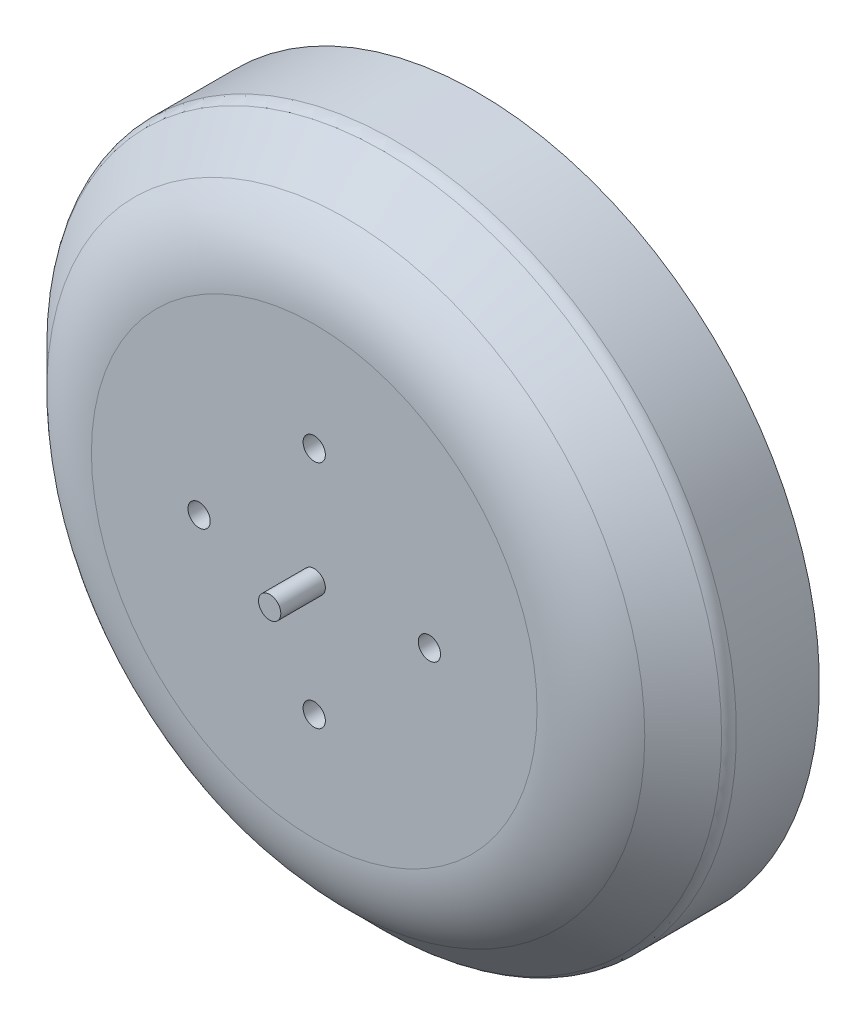
ISO-10303-21;
HEADER;
FILE_DESCRIPTION(('STEP AP214'),'2;1');
FILE_NAME('part.step','',(''),(''),'','','');
FILE_SCHEMA(('AUTOMOTIVE_DESIGN { 1 0 10303 214 1 1 1 1 }'));
ENDSEC;
DATA;
#1=APPLICATION_CONTEXT('core data for automotive mechanical design processes');
#2=APPLICATION_PROTOCOL_DEFINITION('international standard','automotive_design',2000,#1);
#3=PRODUCT_CONTEXT('',#1,'mechanical');
#4=PRODUCT('Part','Part','',(#3));
#5=PRODUCT_RELATED_PRODUCT_CATEGORY('part','',(#4));
#6=PRODUCT_DEFINITION_FORMATION('','',#4);
#7=PRODUCT_DEFINITION_CONTEXT('part definition',#1,'design');
#8=PRODUCT_DEFINITION('design','',#6,#7);
#9=PRODUCT_DEFINITION_SHAPE('','',#8);
#10=(LENGTH_UNIT() NAMED_UNIT(*) SI_UNIT(.MILLI.,.METRE.));
#11=(NAMED_UNIT(*) PLANE_ANGLE_UNIT() SI_UNIT($,.RADIAN.));
#12=(NAMED_UNIT(*) SI_UNIT($,.STERADIAN.) SOLID_ANGLE_UNIT());
#13=UNCERTAINTY_MEASURE_WITH_UNIT(LENGTH_MEASURE(1.E-05),#10,'distance_accuracy_value','');
#14=(GEOMETRIC_REPRESENTATION_CONTEXT(3) GLOBAL_UNCERTAINTY_ASSIGNED_CONTEXT((#13)) GLOBAL_UNIT_ASSIGNED_CONTEXT((#10,
#11,#12)) REPRESENTATION_CONTEXT('',''));
#15=CARTESIAN_POINT('',(0.,0.,0.));
#16=DIRECTION('',(0.,0.,1.));
#17=DIRECTION('',(1.,0.,0.));
#18=AXIS2_PLACEMENT_3D('',#15,#16,#17);
#19=CARTESIAN_POINT('',(0.,0.,-45.5));
#20=DIRECTION('',(0.,0.,1.));
#21=DIRECTION('',(1.,0.,0.));
#22=AXIS2_PLACEMENT_3D('',#19,#20,#21);
#23=CYLINDRICAL_SURFACE('',#22,46.);
#24=CARTESIAN_POINT('',(0.,0.,-27.3284271247462));
#25=DIRECTION('',(0.,0.,-1.));
#26=DIRECTION('',(-1.,0.,0.));
#27=AXIS2_PLACEMENT_3D('',#24,#25,#26);
#28=CIRCLE('',#27,46.);
#29=CARTESIAN_POINT('',(-46.,0.,-27.3284271247462));
#30=VERTEX_POINT('',#29);
#31=EDGE_CURVE('E11',#30,#30,#28,.T.);
#32=ORIENTED_EDGE('',*,*,#31,.T.);
#33=EDGE_LOOP('',(#32));
#34=FACE_BOUND('',#33,.T.);
#35=CARTESIAN_POINT('',(0.,0.,-38.5));
#36=DIRECTION('',(0.,0.,-1.));
#37=DIRECTION('',(-1.,0.,0.));
#38=AXIS2_PLACEMENT_3D('',#35,#36,#37);
#39=CIRCLE('',#38,46.);
#40=CARTESIAN_POINT('',(-46.,0.,-38.5));
#41=VERTEX_POINT('',#40);
#42=EDGE_CURVE('E113',#41,#41,#39,.T.);
#43=ORIENTED_EDGE('',*,*,#42,.F.);
#44=EDGE_LOOP('',(#43));
#45=FACE_BOUND('',#44,.T.);
#46=ADVANCED_FACE('F41',(#34,#45),#23,.T.);
#47=CARTESIAN_POINT('',(0.,0.,-16.5));
#48=DIRECTION('',(0.,0.,1.));
#49=DIRECTION('',(1.,0.,0.));
#50=AXIS2_PLACEMENT_3D('',#47,#48,#49);
#51=PLANE('',#50);
#52=CARTESIAN_POINT('',(0.,0.,-16.5));
#53=DIRECTION('',(0.,0.,1.));
#54=DIRECTION('',(1.,0.,0.));
#55=AXIS2_PLACEMENT_3D('',#52,#53,#54);
#56=CIRCLE('',#55,29.9939033455901);
#57=CARTESIAN_POINT('',(29.9939033455901,0.,-16.5));
#58=VERTEX_POINT('',#57);
#59=EDGE_CURVE('E155',#58,#58,#56,.T.);
#60=ORIENTED_EDGE('',*,*,#59,.T.);
#61=EDGE_LOOP('',(#60));
#62=FACE_BOUND('',#61,.T.);
#63=CARTESIAN_POINT('',(-15.5,0.,-16.5));
#64=DIRECTION('',(0.,0.,1.));
#65=DIRECTION('',(1.,0.,0.));
#66=AXIS2_PLACEMENT_3D('',#63,#64,#65);
#67=CIRCLE('',#66,1.49999999999999);
#68=CARTESIAN_POINT('',(-14.,0.,-16.5));
#69=VERTEX_POINT('',#68);
#70=EDGE_CURVE('E103',#69,#69,#67,.T.);
#71=ORIENTED_EDGE('',*,*,#70,.F.);
#72=EDGE_LOOP('',(#71));
#73=FACE_BOUND('',#72,.T.);
#74=CARTESIAN_POINT('',(0.,15.5,-16.5));
#75=DIRECTION('',(0.,0.,1.));
#76=DIRECTION('',(1.,0.,0.));
#77=AXIS2_PLACEMENT_3D('',#74,#75,#76);
#78=CIRCLE('',#77,1.49999999999999);
#79=CARTESIAN_POINT('',(1.49999999999999,15.5,-16.5));
#80=VERTEX_POINT('',#79);
#81=EDGE_CURVE('E289',#80,#80,#78,.T.);
#82=ORIENTED_EDGE('',*,*,#81,.F.);
#83=EDGE_LOOP('',(#82));
#84=FACE_BOUND('',#83,.T.);
#85=CARTESIAN_POINT('',(0.,-15.5,-16.5));
#86=DIRECTION('',(0.,0.,1.));
#87=DIRECTION('',(1.,0.,0.));
#88=AXIS2_PLACEMENT_3D('',#85,#86,#87);
#89=CIRCLE('',#88,1.49999999999999);
#90=CARTESIAN_POINT('',(1.49999999999999,-15.5,-16.5));
#91=VERTEX_POINT('',#90);
#92=EDGE_CURVE('E297',#91,#91,#89,.T.);
#93=ORIENTED_EDGE('',*,*,#92,.F.);
#94=EDGE_LOOP('',(#93));
#95=FACE_BOUND('',#94,.T.);
#96=CARTESIAN_POINT('',(15.5,0.,-16.5));
#97=DIRECTION('',(0.,0.,1.));
#98=DIRECTION('',(1.,0.,0.));
#99=AXIS2_PLACEMENT_3D('',#96,#97,#98);
#100=CIRCLE('',#99,1.49999999999999);
#101=CARTESIAN_POINT('',(17.,0.,-16.5));
#102=VERTEX_POINT('',#101);
#103=EDGE_CURVE('E305',#102,#102,#100,.T.);
#104=ORIENTED_EDGE('',*,*,#103,.F.);
#105=EDGE_LOOP('',(#104));
#106=FACE_BOUND('',#105,.T.);
#107=CARTESIAN_POINT('',(0.,0.,-16.5));
#108=DIRECTION('',(0.,0.,1.));
#109=DIRECTION('',(1.,0.,0.));
#110=AXIS2_PLACEMENT_3D('',#107,#108,#109);
#111=CIRCLE('',#110,1.5);
#112=CARTESIAN_POINT('',(1.5,0.,-16.5));
#113=VERTEX_POINT('',#112);
#114=EDGE_CURVE('E262',#113,#113,#111,.T.);
#115=ORIENTED_EDGE('',*,*,#114,.F.);
#116=EDGE_LOOP('',(#115));
#117=FACE_BOUND('',#116,.T.);
#118=ADVANCED_FACE('F182',(#62,#73,#84,#95,#106,#117),#51,.T.);
#119=CARTESIAN_POINT('',(0.,0.,-16.5));
#120=DIRECTION('',(0.,0.,-1.));
#121=DIRECTION('',(-1.,0.,0.));
#122=AXIS2_PLACEMENT_3D('',#119,#120,#121);
#123=CONICAL_SURFACE('',#122,36.,0.785398163397448);
#124=CARTESIAN_POINT('',(0.,0.,-25.9142135623731));
#125=DIRECTION('',(0.,0.,1.));
#126=DIRECTION('',(1.,0.,0.));
#127=AXIS2_PLACEMENT_3D('',#124,#125,#126);
#128=CIRCLE('',#127,45.4142135623731);
#129=CARTESIAN_POINT('',(45.4142135623731,0.,-25.9142135623731));
#130=VERTEX_POINT('',#129);
#131=EDGE_CURVE('E50',#130,#130,#128,.T.);
#132=ORIENTED_EDGE('',*,*,#131,.T.);
#133=EDGE_LOOP('',(#132));
#134=FACE_BOUND('',#133,.T.);
#135=CARTESIAN_POINT('',(0.,0.,-20.7469516727951));
#136=DIRECTION('',(0.,0.,1.));
#137=DIRECTION('',(1.,0.,0.));
#138=AXIS2_PLACEMENT_3D('',#135,#136,#137);
#139=CIRCLE('',#138,40.2469516727951);
#140=CARTESIAN_POINT('',(40.2469516727951,0.,-20.7469516727951));
#141=VERTEX_POINT('',#140);
#142=EDGE_CURVE('E159',#141,#141,#139,.F.);
#143=ORIENTED_EDGE('',*,*,#142,.T.);
#144=EDGE_LOOP('',(#143));
#145=FACE_BOUND('',#144,.T.);
#146=ADVANCED_FACE('F166',(#134,#145),#123,.T.);
#147=CARTESIAN_POINT('',(0.,0.,-10.5));
#148=DIRECTION('',(0.,0.,-1.));
#149=DIRECTION('',(-1.,0.,0.));
#150=AXIS2_PLACEMENT_3D('',#147,#148,#149);
#151=CYLINDRICAL_SURFACE('',#150,1.5);
#152=CARTESIAN_POINT('',(0.,0.,-10.5));
#153=DIRECTION('',(0.,0.,1.));
#154=DIRECTION('',(1.,0.,0.));
#155=AXIS2_PLACEMENT_3D('',#152,#153,#154);
#156=CIRCLE('',#155,1.5);
#157=CARTESIAN_POINT('',(1.5,0.,-10.5));
#158=VERTEX_POINT('',#157);
#159=EDGE_CURVE('E258',#158,#158,#156,.T.);
#160=ORIENTED_EDGE('',*,*,#159,.F.);
#161=EDGE_LOOP('',(#160));
#162=FACE_BOUND('',#161,.T.);
#163=ORIENTED_EDGE('',*,*,#114,.T.);
#164=EDGE_LOOP('',(#163));
#165=FACE_BOUND('',#164,.T.);
#166=ADVANCED_FACE('F196',(#162,#165),#151,.T.);
#167=CARTESIAN_POINT('',(0.,0.,-10.5));
#168=DIRECTION('',(0.,0.,1.));
#169=DIRECTION('',(1.,0.,0.));
#170=AXIS2_PLACEMENT_3D('',#167,#168,#169);
#171=PLANE('',#170);
#172=ORIENTED_EDGE('',*,*,#159,.T.);
#173=EDGE_LOOP('',(#172));
#174=FACE_BOUND('',#173,.T.);
#175=ADVANCED_FACE('F338',(#174),#171,.T.);
#176=CARTESIAN_POINT('',(15.5,0.,-26.5));
#177=DIRECTION('',(0.,0.,-1.));
#178=DIRECTION('',(-1.,0.,0.));
#179=AXIS2_PLACEMENT_3D('',#176,#177,#178);
#180=PLANE('',#179);
#181=CARTESIAN_POINT('',(15.5,0.,-26.5));
#182=DIRECTION('',(0.,0.,1.));
#183=DIRECTION('',(1.,0.,0.));
#184=AXIS2_PLACEMENT_3D('',#181,#182,#183);
#185=CIRCLE('',#184,1.49999999999999);
#186=CARTESIAN_POINT('',(17.,0.,-26.5));
#187=VERTEX_POINT('',#186);
#188=EDGE_CURVE('E309',#187,#187,#185,.T.);
#189=ORIENTED_EDGE('',*,*,#188,.T.);
#190=EDGE_LOOP('',(#189));
#191=FACE_BOUND('',#190,.T.);
#192=ADVANCED_FACE('F342',(#191),#180,.F.);
#193=CARTESIAN_POINT('',(15.5,0.,-16.5));
#194=DIRECTION('',(0.,0.,1.));
#195=DIRECTION('',(1.,0.,0.));
#196=AXIS2_PLACEMENT_3D('',#193,#194,#195);
#197=CYLINDRICAL_SURFACE('',#196,1.49999999999999);
#198=ORIENTED_EDGE('',*,*,#188,.F.);
#199=EDGE_LOOP('',(#198));
#200=FACE_BOUND('',#199,.T.);
#201=ORIENTED_EDGE('',*,*,#103,.T.);
#202=EDGE_LOOP('',(#201));
#203=FACE_BOUND('',#202,.T.);
#204=ADVANCED_FACE('F346',(#200,#203),#197,.F.);
#205=CARTESIAN_POINT('',(0.,-15.5,-26.5));
#206=DIRECTION('',(0.,0.,-1.));
#207=DIRECTION('',(-1.,0.,0.));
#208=AXIS2_PLACEMENT_3D('',#205,#206,#207);
#209=PLANE('',#208);
#210=CARTESIAN_POINT('',(0.,-15.5,-26.5));
#211=DIRECTION('',(0.,0.,1.));
#212=DIRECTION('',(1.,0.,0.));
#213=AXIS2_PLACEMENT_3D('',#210,#211,#212);
#214=CIRCLE('',#213,1.49999999999999);
#215=CARTESIAN_POINT('',(1.49999999999999,-15.5,-26.5));
#216=VERTEX_POINT('',#215);
#217=EDGE_CURVE('E301',#216,#216,#214,.T.);
#218=ORIENTED_EDGE('',*,*,#217,.T.);
#219=EDGE_LOOP('',(#218));
#220=FACE_BOUND('',#219,.T.);
#221=ADVANCED_FACE('F350',(#220),#209,.F.);
#222=CARTESIAN_POINT('',(0.,-15.5,-16.5));
#223=DIRECTION('',(0.,0.,1.));
#224=DIRECTION('',(1.,0.,0.));
#225=AXIS2_PLACEMENT_3D('',#222,#223,#224);
#226=CYLINDRICAL_SURFACE('',#225,1.49999999999999);
#227=ORIENTED_EDGE('',*,*,#217,.F.);
#228=EDGE_LOOP('',(#227));
#229=FACE_BOUND('',#228,.T.);
#230=ORIENTED_EDGE('',*,*,#92,.T.);
#231=EDGE_LOOP('',(#230));
#232=FACE_BOUND('',#231,.T.);
#233=ADVANCED_FACE('F354',(#229,#232),#226,.F.);
#234=CARTESIAN_POINT('',(0.,15.5,-26.5));
#235=DIRECTION('',(0.,0.,-1.));
#236=DIRECTION('',(-1.,0.,0.));
#237=AXIS2_PLACEMENT_3D('',#234,#235,#236);
#238=PLANE('',#237);
#239=CARTESIAN_POINT('',(0.,15.5,-26.5));
#240=DIRECTION('',(0.,0.,1.));
#241=DIRECTION('',(1.,0.,0.));
#242=AXIS2_PLACEMENT_3D('',#239,#240,#241);
#243=CIRCLE('',#242,1.49999999999999);
#244=CARTESIAN_POINT('',(1.49999999999999,15.5,-26.5));
#245=VERTEX_POINT('',#244);
#246=EDGE_CURVE('E293',#245,#245,#243,.T.);
#247=ORIENTED_EDGE('',*,*,#246,.T.);
#248=EDGE_LOOP('',(#247));
#249=FACE_BOUND('',#248,.T.);
#250=ADVANCED_FACE('F358',(#249),#238,.F.);
#251=CARTESIAN_POINT('',(0.,15.5,-16.5));
#252=DIRECTION('',(0.,0.,1.));
#253=DIRECTION('',(1.,0.,0.));
#254=AXIS2_PLACEMENT_3D('',#251,#252,#253);
#255=CYLINDRICAL_SURFACE('',#254,1.49999999999999);
#256=ORIENTED_EDGE('',*,*,#246,.F.);
#257=EDGE_LOOP('',(#256));
#258=FACE_BOUND('',#257,.T.);
#259=ORIENTED_EDGE('',*,*,#81,.T.);
#260=EDGE_LOOP('',(#259));
#261=FACE_BOUND('',#260,.T.);
#262=ADVANCED_FACE('F362',(#258,#261),#255,.F.);
#263=CARTESIAN_POINT('',(-15.5,0.,-26.5));
#264=DIRECTION('',(0.,0.,-1.));
#265=DIRECTION('',(-1.,0.,0.));
#266=AXIS2_PLACEMENT_3D('',#263,#264,#265);
#267=PLANE('',#266);
#268=CARTESIAN_POINT('',(-15.5,0.,-26.5));
#269=DIRECTION('',(0.,0.,1.));
#270=DIRECTION('',(1.,0.,0.));
#271=AXIS2_PLACEMENT_3D('',#268,#269,#270);
#272=CIRCLE('',#271,1.49999999999999);
#273=CARTESIAN_POINT('',(-14.,0.,-26.5));
#274=VERTEX_POINT('',#273);
#275=EDGE_CURVE('E285',#274,#274,#272,.T.);
#276=ORIENTED_EDGE('',*,*,#275,.T.);
#277=EDGE_LOOP('',(#276));
#278=FACE_BOUND('',#277,.T.);
#279=ADVANCED_FACE('F366',(#278),#267,.F.);
#280=CARTESIAN_POINT('',(-15.5,0.,-16.5));
#281=DIRECTION('',(0.,0.,1.));
#282=DIRECTION('',(1.,0.,0.));
#283=AXIS2_PLACEMENT_3D('',#280,#281,#282);
#284=CYLINDRICAL_SURFACE('',#283,1.49999999999999);
#285=ORIENTED_EDGE('',*,*,#275,.F.);
#286=EDGE_LOOP('',(#285));
#287=FACE_BOUND('',#286,.T.);
#288=ORIENTED_EDGE('',*,*,#70,.T.);
#289=EDGE_LOOP('',(#288));
#290=FACE_BOUND('',#289,.T.);
#291=ADVANCED_FACE('F178',(#287,#290),#284,.F.);
#292=CARTESIAN_POINT('',(0.,0.,-31.));
#293=DIRECTION('',(0.,0.,1.));
#294=DIRECTION('',(1.,0.,0.));
#295=AXIS2_PLACEMENT_3D('',#292,#293,#294);
#296=TOROIDAL_SURFACE('',#295,29.9939033455901,14.5);
#297=ORIENTED_EDGE('',*,*,#142,.F.);
#298=EDGE_LOOP('',(#297));
#299=FACE_BOUND('',#298,.T.);
#300=ORIENTED_EDGE('',*,*,#59,.F.);
#301=EDGE_LOOP('',(#300));
#302=FACE_BOUND('',#301,.T.);
#303=ADVANCED_FACE('F170',(#299,#302),#296,.T.);
#304=CARTESIAN_POINT('',(0.,0.,-27.3284271247462));
#305=DIRECTION('',(0.,0.,-1.));
#306=DIRECTION('',(-1.,0.,0.));
#307=AXIS2_PLACEMENT_3D('',#304,#305,#306);
#308=TOROIDAL_SURFACE('',#307,44.,2.);
#309=ORIENTED_EDGE('',*,*,#31,.F.);
#310=EDGE_LOOP('',(#309));
#311=FACE_BOUND('',#310,.T.);
#312=ORIENTED_EDGE('',*,*,#131,.F.);
#313=EDGE_LOOP('',(#312));
#314=FACE_BOUND('',#313,.T.);
#315=ADVANCED_FACE('F43',(#311,#314),#308,.T.);
#316=CARTESIAN_POINT('',(0.,0.,-49.5));
#317=DIRECTION('',(0.,0.,1.));
#318=DIRECTION('',(1.,0.,0.));
#319=AXIS2_PLACEMENT_3D('',#316,#317,#318);
#320=CYLINDRICAL_SURFACE('',#319,9.81495457622364);
#321=CARTESIAN_POINT('',(0.,0.,-45.5));
#322=DIRECTION('',(0.,0.,-1.));
#323=DIRECTION('',(-1.,0.,0.));
#324=AXIS2_PLACEMENT_3D('',#321,#322,#323);
#325=CIRCLE('',#324,9.81495457622364);
#326=CARTESIAN_POINT('',(9.81495457622364,0.,-45.5));
#327=VERTEX_POINT('',#326);
#328=CARTESIAN_POINT('',(4.90747728811182,8.5,-45.5));
#329=VERTEX_POINT('',#328);
#330=EDGE_CURVE('E94',#327,#329,#325,.F.);
#331=ORIENTED_EDGE('',*,*,#330,.T.);
#332=CARTESIAN_POINT('',(-4.90747728811182,8.5,-45.5));
#333=VERTEX_POINT('',#332);
#334=EDGE_CURVE('E57',#329,#333,#325,.F.);
#335=ORIENTED_EDGE('',*,*,#334,.T.);
#336=CARTESIAN_POINT('',(-9.81495457622364,0.,-45.5));
#337=VERTEX_POINT('',#336);
#338=EDGE_CURVE('E112',#333,#337,#325,.F.);
#339=ORIENTED_EDGE('',*,*,#338,.T.);
#340=CARTESIAN_POINT('',(-4.90747728811182,-8.5,-45.5));
#341=VERTEX_POINT('',#340);
#342=EDGE_CURVE('E275',#337,#341,#325,.F.);
#343=ORIENTED_EDGE('',*,*,#342,.T.);
#344=CARTESIAN_POINT('',(4.90747728811182,-8.5,-45.5));
#345=VERTEX_POINT('',#344);
#346=EDGE_CURVE('E245',#341,#345,#325,.F.);
#347=ORIENTED_EDGE('',*,*,#346,.T.);
#348=EDGE_CURVE('E98',#345,#327,#325,.F.);
#349=ORIENTED_EDGE('',*,*,#348,.T.);
#350=EDGE_LOOP('',(#331,#335,#339,#343,#347,#349));
#351=FACE_BOUND('',#350,.T.);
#352=CARTESIAN_POINT('',(0.,0.,-38.5));
#353=DIRECTION('',(0.,0.,-1.));
#354=DIRECTION('',(-1.,0.,0.));
#355=AXIS2_PLACEMENT_3D('',#352,#353,#354);
#356=CIRCLE('',#355,9.81495457622364);
#357=CARTESIAN_POINT('',(-9.81495457622364,0.,-38.5));
#358=VERTEX_POINT('',#357);
#359=EDGE_CURVE('E562',#358,#358,#356,.T.);
#360=ORIENTED_EDGE('',*,*,#359,.T.);
#361=EDGE_LOOP('',(#360));
#362=FACE_BOUND('',#361,.T.);
#363=ADVANCED_FACE('F95',(#351,#362),#320,.T.);
#364=CARTESIAN_POINT('',(0.,0.,-38.5));
#365=DIRECTION('',(0.,0.,-1.));
#366=DIRECTION('',(-1.,0.,0.));
#367=AXIS2_PLACEMENT_3D('',#364,#365,#366);
#368=PLANE('',#367);
#369=ORIENTED_EDGE('',*,*,#359,.F.);
#370=EDGE_LOOP('',(#369));
#371=FACE_BOUND('',#370,.T.);
#372=ORIENTED_EDGE('',*,*,#42,.T.);
#373=EDGE_LOOP('',(#372));
#374=FACE_BOUND('',#373,.T.);
#375=ADVANCED_FACE('F176',(#371,#374),#368,.T.);
#376=CARTESIAN_POINT('',(0.,0.,-49.5));
#377=DIRECTION('',(0.,0.,1.));
#378=DIRECTION('',(1.,0.,0.));
#379=AXIS2_PLACEMENT_3D('',#376,#377,#378);
#380=PLANE('',#379);
#381=DIRECTION('',(-0.499999999999999,-0.866025403784439,0.));
#382=VECTOR('',#381,1.);
#383=CARTESIAN_POINT('',(4.90747728811183,-8.5,-49.5));
#384=LINE('',#383,#382);
#385=CARTESIAN_POINT('',(9.81495457622364,0.,-49.5));
#386=VERTEX_POINT('',#385);
#387=CARTESIAN_POINT('',(4.90747728811183,-8.5,-49.5));
#388=VERTEX_POINT('',#387);
#389=EDGE_CURVE('E121',#386,#388,#384,.T.);
#390=ORIENTED_EDGE('',*,*,#389,.T.);
#391=DIRECTION('',(-1.,0.,0.));
#392=VECTOR('',#391,1.);
#393=CARTESIAN_POINT('',(-4.90747728811182,-8.5,-49.5));
#394=LINE('',#393,#392);
#395=CARTESIAN_POINT('',(-4.90747728811182,-8.5,-49.5));
#396=VERTEX_POINT('',#395);
#397=EDGE_CURVE('E255',#388,#396,#394,.T.);
#398=ORIENTED_EDGE('',*,*,#397,.T.);
#399=DIRECTION('',(-0.5,0.866025403784439,0.));
#400=VECTOR('',#399,1.);
#401=CARTESIAN_POINT('',(-9.81495457622364,0.,-49.5));
#402=LINE('',#401,#400);
#403=CARTESIAN_POINT('',(-9.81495457622364,0.,-49.5));
#404=VERTEX_POINT('',#403);
#405=EDGE_CURVE('E320',#396,#404,#402,.T.);
#406=ORIENTED_EDGE('',*,*,#405,.T.);
#407=DIRECTION('',(0.5,0.866025403784439,0.));
#408=VECTOR('',#407,1.);
#409=CARTESIAN_POINT('',(-4.90747728811182,8.5,-49.5));
#410=LINE('',#409,#408);
#411=CARTESIAN_POINT('',(-4.90747728811182,8.5,-49.5));
#412=VERTEX_POINT('',#411);
#413=EDGE_CURVE('E323',#404,#412,#410,.T.);
#414=ORIENTED_EDGE('',*,*,#413,.T.);
#415=DIRECTION('',(1.,0.,0.));
#416=VECTOR('',#415,1.);
#417=CARTESIAN_POINT('',(4.90747728811182,8.5,-49.5));
#418=LINE('',#417,#416);
#419=CARTESIAN_POINT('',(4.90747728811182,8.5,-49.5));
#420=VERTEX_POINT('',#419);
#421=EDGE_CURVE('E325',#412,#420,#418,.T.);
#422=ORIENTED_EDGE('',*,*,#421,.T.);
#423=DIRECTION('',(0.5,-0.866025403784439,0.));
#424=VECTOR('',#423,1.);
#425=CARTESIAN_POINT('',(9.81495457622364,0.,-49.5));
#426=LINE('',#425,#424);
#427=EDGE_CURVE('E65',#420,#386,#426,.T.);
#428=ORIENTED_EDGE('',*,*,#427,.T.);
#429=EDGE_LOOP('',(#390,#398,#406,#414,#422,#428));
#430=FACE_BOUND('',#429,.T.);
#431=ADVANCED_FACE('F222',(#430),#380,.F.);
#432=CARTESIAN_POINT('',(-4.90747728811182,8.5,-49.5));
#433=DIRECTION('',(0.866025403784439,-0.5,0.));
#434=DIRECTION('',(0.5,0.866025403784439,0.));
#435=AXIS2_PLACEMENT_3D('',#432,#433,#434);
#436=PLANE('',#435);
#437=DIRECTION('',(0.5,0.866025403784439,0.));
#438=VECTOR('',#437,1.);
#439=CARTESIAN_POINT('',(-4.90747728811182,8.5,-45.5));
#440=LINE('',#439,#438);
#441=EDGE_CURVE('E132',#337,#333,#440,.T.);
#442=ORIENTED_EDGE('',*,*,#441,.T.);
#443=DIRECTION('',(0.,0.,1.));
#444=VECTOR('',#443,1.);
#445=CARTESIAN_POINT('',(-4.90747728811182,8.5,-49.5));
#446=LINE('',#445,#444);
#447=EDGE_CURVE('E130',#412,#333,#446,.T.);
#448=ORIENTED_EDGE('',*,*,#447,.F.);
#449=ORIENTED_EDGE('',*,*,#413,.F.);
#450=DIRECTION('',(0.,0.,1.));
#451=VECTOR('',#450,1.);
#452=CARTESIAN_POINT('',(-9.81495457622364,0.,-49.5));
#453=LINE('',#452,#451);
#454=EDGE_CURVE('E140',#404,#337,#453,.T.);
#455=ORIENTED_EDGE('',*,*,#454,.T.);
#456=EDGE_LOOP('',(#442,#448,#449,#455));
#457=FACE_BOUND('',#456,.T.);
#458=ADVANCED_FACE('F215',(#457),#436,.F.);
#459=CARTESIAN_POINT('',(27.9999999999998,0.,-45.5));
#460=DIRECTION('',(0.,0.,-1.));
#461=DIRECTION('',(-1.,0.,0.));
#462=AXIS2_PLACEMENT_3D('',#459,#460,#461);
#463=PLANE('',#462);
#464=ORIENTED_EDGE('',*,*,#338,.F.);
#465=ORIENTED_EDGE('',*,*,#441,.F.);
#466=EDGE_LOOP('',(#464,#465));
#467=FACE_BOUND('',#466,.T.);
#468=ADVANCED_FACE('F203',(#467),#463,.T.);
#469=CARTESIAN_POINT('',(4.90747728811182,8.5,-49.5));
#470=DIRECTION('',(0.,-1.,0.));
#471=DIRECTION('',(0.,0.,-1.));
#472=AXIS2_PLACEMENT_3D('',#469,#470,#471);
#473=PLANE('',#472);
#474=DIRECTION('',(1.,0.,0.));
#475=VECTOR('',#474,1.);
#476=CARTESIAN_POINT('',(4.90747728811182,8.5,-45.5));
#477=LINE('',#476,#475);
#478=EDGE_CURVE('E109',#333,#329,#477,.T.);
#479=ORIENTED_EDGE('',*,*,#478,.T.);
#480=DIRECTION('',(0.,0.,1.));
#481=VECTOR('',#480,1.);
#482=CARTESIAN_POINT('',(4.90747728811182,8.5,-49.5));
#483=LINE('',#482,#481);
#484=EDGE_CURVE('E128',#420,#329,#483,.T.);
#485=ORIENTED_EDGE('',*,*,#484,.F.);
#486=ORIENTED_EDGE('',*,*,#421,.F.);
#487=ORIENTED_EDGE('',*,*,#447,.T.);
#488=EDGE_LOOP('',(#479,#485,#486,#487));
#489=FACE_BOUND('',#488,.T.);
#490=ADVANCED_FACE('F126',(#489),#473,.F.);
#491=ORIENTED_EDGE('',*,*,#334,.F.);
#492=ORIENTED_EDGE('',*,*,#478,.F.);
#493=EDGE_LOOP('',(#491,#492));
#494=FACE_BOUND('',#493,.T.);
#495=ADVANCED_FACE('F107',(#494),#463,.T.);
#496=CARTESIAN_POINT('',(9.81495457622364,0.,-49.5));
#497=DIRECTION('',(-0.866025403784439,-0.5,0.));
#498=DIRECTION('',(0.5,-0.866025403784439,0.));
#499=AXIS2_PLACEMENT_3D('',#496,#497,#498);
#500=PLANE('',#499);
#501=DIRECTION('',(0.5,-0.866025403784439,0.));
#502=VECTOR('',#501,1.);
#503=CARTESIAN_POINT('',(9.81495457622364,0.,-45.5));
#504=LINE('',#503,#502);
#505=EDGE_CURVE('E115',#329,#327,#504,.T.);
#506=ORIENTED_EDGE('',*,*,#505,.T.);
#507=DIRECTION('',(0.,0.,1.));
#508=VECTOR('',#507,1.);
#509=CARTESIAN_POINT('',(9.81495457622364,0.,-49.5));
#510=LINE('',#509,#508);
#511=EDGE_CURVE('E136',#386,#327,#510,.T.);
#512=ORIENTED_EDGE('',*,*,#511,.F.);
#513=ORIENTED_EDGE('',*,*,#427,.F.);
#514=ORIENTED_EDGE('',*,*,#484,.T.);
#515=EDGE_LOOP('',(#506,#512,#513,#514));
#516=FACE_BOUND('',#515,.T.);
#517=ADVANCED_FACE('F134',(#516),#500,.F.);
#518=ORIENTED_EDGE('',*,*,#330,.F.);
#519=ORIENTED_EDGE('',*,*,#505,.F.);
#520=EDGE_LOOP('',(#518,#519));
#521=FACE_BOUND('',#520,.T.);
#522=ADVANCED_FACE('F116',(#521),#463,.T.);
#523=CARTESIAN_POINT('',(4.90747728811183,-8.5,-49.5));
#524=DIRECTION('',(-0.866025403784439,0.499999999999999,0.));
#525=DIRECTION('',(-0.499999999999999,-0.866025403784439,0.));
#526=AXIS2_PLACEMENT_3D('',#523,#524,#525);
#527=PLANE('',#526);
#528=DIRECTION('',(-0.499999999999999,-0.866025403784439,0.));
#529=VECTOR('',#528,1.);
#530=CARTESIAN_POINT('',(4.90747728811183,-8.5,-45.5));
#531=LINE('',#530,#529);
#532=EDGE_CURVE('E243',#327,#345,#531,.T.);
#533=ORIENTED_EDGE('',*,*,#532,.T.);
#534=DIRECTION('',(0.,0.,1.));
#535=VECTOR('',#534,1.);
#536=CARTESIAN_POINT('',(4.90747728811183,-8.5,-49.5));
#537=LINE('',#536,#535);
#538=EDGE_CURVE('E151',#388,#345,#537,.T.);
#539=ORIENTED_EDGE('',*,*,#538,.F.);
#540=ORIENTED_EDGE('',*,*,#389,.F.);
#541=ORIENTED_EDGE('',*,*,#511,.T.);
#542=EDGE_LOOP('',(#533,#539,#540,#541));
#543=FACE_BOUND('',#542,.T.);
#544=ADVANCED_FACE('F193',(#543),#527,.F.);
#545=ORIENTED_EDGE('',*,*,#348,.F.);
#546=ORIENTED_EDGE('',*,*,#532,.F.);
#547=EDGE_LOOP('',(#545,#546));
#548=FACE_BOUND('',#547,.T.);
#549=ADVANCED_FACE('F213',(#548),#463,.T.);
#550=CARTESIAN_POINT('',(-4.90747728811182,-8.5,-49.5));
#551=DIRECTION('',(0.,1.,0.));
#552=DIRECTION('',(0.,0.,1.));
#553=AXIS2_PLACEMENT_3D('',#550,#551,#552);
#554=PLANE('',#553);
#555=DIRECTION('',(-1.,0.,0.));
#556=VECTOR('',#555,1.);
#557=CARTESIAN_POINT('',(-4.90747728811182,-8.5,-45.5));
#558=LINE('',#557,#556);
#559=EDGE_CURVE('E248',#345,#341,#558,.T.);
#560=ORIENTED_EDGE('',*,*,#559,.T.);
#561=DIRECTION('',(0.,0.,1.));
#562=VECTOR('',#561,1.);
#563=CARTESIAN_POINT('',(-4.90747728811182,-8.5,-49.5));
#564=LINE('',#563,#562);
#565=EDGE_CURVE('E147',#396,#341,#564,.T.);
#566=ORIENTED_EDGE('',*,*,#565,.F.);
#567=ORIENTED_EDGE('',*,*,#397,.F.);
#568=ORIENTED_EDGE('',*,*,#538,.T.);
#569=EDGE_LOOP('',(#560,#566,#567,#568));
#570=FACE_BOUND('',#569,.T.);
#571=ADVANCED_FACE('F211',(#570),#554,.F.);
#572=ORIENTED_EDGE('',*,*,#346,.F.);
#573=ORIENTED_EDGE('',*,*,#559,.F.);
#574=EDGE_LOOP('',(#572,#573));
#575=FACE_BOUND('',#574,.T.);
#576=ADVANCED_FACE('F202',(#575),#463,.T.);
#577=CARTESIAN_POINT('',(-9.81495457622364,0.,-49.5));
#578=DIRECTION('',(0.866025403784439,0.5,0.));
#579=DIRECTION('',(-0.5,0.866025403784439,0.));
#580=AXIS2_PLACEMENT_3D('',#577,#578,#579);
#581=PLANE('',#580);
#582=DIRECTION('',(-0.5,0.866025403784439,0.));
#583=VECTOR('',#582,1.);
#584=CARTESIAN_POINT('',(-9.81495457622364,0.,-45.5));
#585=LINE('',#584,#583);
#586=EDGE_CURVE('E252',#341,#337,#585,.T.);
#587=ORIENTED_EDGE('',*,*,#586,.T.);
#588=ORIENTED_EDGE('',*,*,#454,.F.);
#589=ORIENTED_EDGE('',*,*,#405,.F.);
#590=ORIENTED_EDGE('',*,*,#565,.T.);
#591=EDGE_LOOP('',(#587,#588,#589,#590));
#592=FACE_BOUND('',#591,.T.);
#593=ADVANCED_FACE('F200',(#592),#581,.F.);
#594=ORIENTED_EDGE('',*,*,#342,.F.);
#595=ORIENTED_EDGE('',*,*,#586,.F.);
#596=EDGE_LOOP('',(#594,#595));
#597=FACE_BOUND('',#596,.T.);
#598=ADVANCED_FACE('F198',(#597),#463,.T.);
#599=CLOSED_SHELL('',(#46,#118,#146,#166,#175,#192,#204,#221,#233,#250,#262,#279,#291,#303,#315,
#363,#375,#431,#458,#468,#490,#495,#517,#522,#544,#549,#571,#576,#593,#598));
#600=MANIFOLD_SOLID_BREP('B2',#599);
#601=ADVANCED_BREP_SHAPE_REPRESENTATION('',(#18,#600),#14);
#602=SHAPE_DEFINITION_REPRESENTATION(#9,#601);
ENDSEC;
END-ISO-10303-21;
